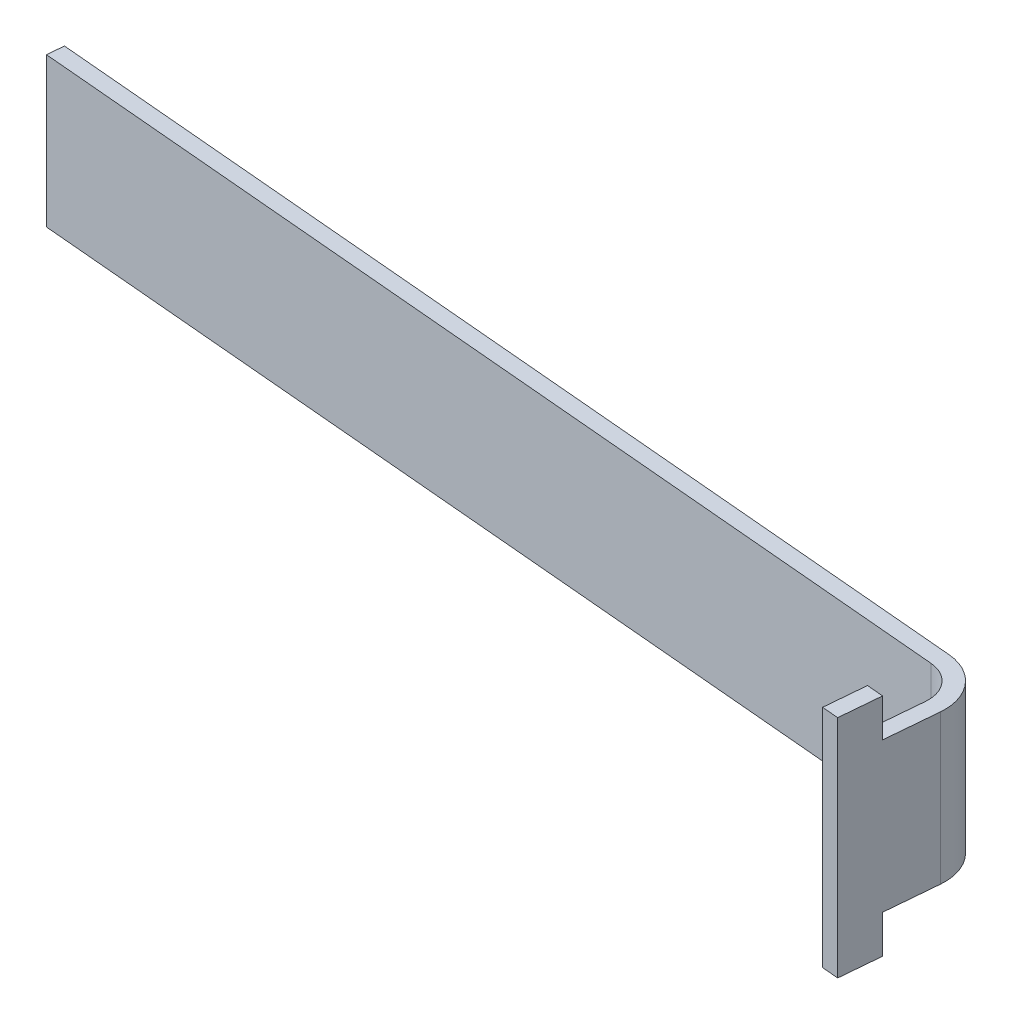
ISO-10303-21;
HEADER;
FILE_DESCRIPTION(('STEP AP214'),'2;1');
FILE_NAME('part.step','',(''),(''),'','','');
FILE_SCHEMA(('AUTOMOTIVE_DESIGN { 1 0 10303 214 1 1 1 1 }'));
ENDSEC;
DATA;
#1=APPLICATION_CONTEXT('core data for automotive mechanical design processes');
#2=APPLICATION_PROTOCOL_DEFINITION('international standard','automotive_design',2000,#1);
#3=PRODUCT_CONTEXT('',#1,'mechanical');
#4=PRODUCT('Part','Part','',(#3));
#5=PRODUCT_RELATED_PRODUCT_CATEGORY('part','',(#4));
#6=PRODUCT_DEFINITION_FORMATION('','',#4);
#7=PRODUCT_DEFINITION_CONTEXT('part definition',#1,'design');
#8=PRODUCT_DEFINITION('design','',#6,#7);
#9=PRODUCT_DEFINITION_SHAPE('','',#8);
#10=(LENGTH_UNIT() NAMED_UNIT(*) SI_UNIT(.MILLI.,.METRE.));
#11=(NAMED_UNIT(*) PLANE_ANGLE_UNIT() SI_UNIT($,.RADIAN.));
#12=(NAMED_UNIT(*) SI_UNIT($,.STERADIAN.) SOLID_ANGLE_UNIT());
#13=UNCERTAINTY_MEASURE_WITH_UNIT(LENGTH_MEASURE(1.E-05),#10,'distance_accuracy_value','');
#14=(GEOMETRIC_REPRESENTATION_CONTEXT(3) GLOBAL_UNCERTAINTY_ASSIGNED_CONTEXT((#13)) GLOBAL_UNIT_ASSIGNED_CONTEXT((#10,
#11,#12)) REPRESENTATION_CONTEXT('',''));
#15=CARTESIAN_POINT('',(0.,0.,0.));
#16=DIRECTION('',(0.,0.,1.));
#17=DIRECTION('',(1.,0.,0.));
#18=AXIS2_PLACEMENT_3D('',#15,#16,#17);
#19=CARTESIAN_POINT('',(-27.6798388038789,2.7391987028386,-10.7652171688286));
#20=DIRECTION('',(-0.996194698091743,0.,-0.0871557427476827));
#21=DIRECTION('',(-0.0871557427476827,0.,0.996194698091743));
#22=AXIS2_PLACEMENT_3D('',#19,#20,#21);
#23=PLANE('',#22);
#24=DIRECTION('',(0.0871557427476827,0.,-0.996194698091743));
#25=VECTOR('',#24,1.);
#26=CARTESIAN_POINT('',(-27.7024992969933,7.2508012971614,-10.5062065473247));
#27=LINE('',#26,#25);
#28=CARTESIAN_POINT('',(-27.7242882326802,7.2508012971614,-10.2571578728018));
#29=VERTEX_POINT('',#28);
#30=CARTESIAN_POINT('',(-27.6807103613064,7.2508012971614,-10.7552552218477));
#31=VERTEX_POINT('',#30);
#32=EDGE_CURVE('E179',#29,#31,#27,.T.);
#33=ORIENTED_EDGE('',*,*,#32,.T.);
#34=DIRECTION('',(0.,1.,0.));
#35=VECTOR('',#34,1.);
#36=CARTESIAN_POINT('',(-27.6807103613064,5.,-10.7552552218477));
#37=LINE('',#36,#35);
#38=CARTESIAN_POINT('',(-27.6807103613064,2.7491987028386,-10.7552552218477));
#39=VERTEX_POINT('',#38);
#40=EDGE_CURVE('E182',#39,#31,#37,.T.);
#41=ORIENTED_EDGE('',*,*,#40,.F.);
#42=DIRECTION('',(0.0871557427476363,0.,-0.996194698091747));
#43=VECTOR('',#42,1.);
#44=CARTESIAN_POINT('',(-27.8162375503035,2.7491987028386,-9.20617236316462));
#45=LINE('',#44,#43);
#46=CARTESIAN_POINT('',(-27.7242882326803,2.7491987028386,-10.2571578728018));
#47=VERTEX_POINT('',#46);
#48=EDGE_CURVE('E191',#47,#39,#45,.T.);
#49=ORIENTED_EDGE('',*,*,#48,.F.);
#50=DIRECTION('',(0.,-1.,0.));
#51=VECTOR('',#50,1.);
#52=CARTESIAN_POINT('',(-27.7242882326803,5.,-10.2571578728018));
#53=LINE('',#52,#51);
#54=EDGE_CURVE('E177',#29,#47,#53,.T.);
#55=ORIENTED_EDGE('',*,*,#54,.F.);
#56=EDGE_LOOP('',(#33,#41,#49,#55));
#57=FACE_BOUND('',#56,.T.);
#58=ADVANCED_FACE('F17',(#57),#23,.T.);
#59=CARTESIAN_POINT('',(-27.7342501796612,2.7391987028386,-10.2580294302293));
#60=DIRECTION('',(-0.0871557427476576,0.,0.996194698091746));
#61=DIRECTION('',(0.996194698091746,0.,0.0871557427476576));
#62=AXIS2_PLACEMENT_3D('',#59,#60,#61);
#63=PLANE('',#62);
#64=DIRECTION('',(0.996194698091746,0.,0.0871557427476576));
#65=VECTOR('',#64,1.);
#66=CARTESIAN_POINT('',(-12.3579842847549,7.2508012971614,-8.91278047706468));
#67=LINE('',#66,#65);
#68=CARTESIAN_POINT('',(1.51402761603295,7.2508012971614,-7.69913669544906));
#69=VERTEX_POINT('',#68);
#70=EDGE_CURVE('E203',#29,#69,#67,.T.);
#71=ORIENTED_EDGE('',*,*,#70,.F.);
#72=ORIENTED_EDGE('',*,*,#54,.T.);
#73=DIRECTION('',(-0.996194698091746,0.,-0.0871557427476576));
#74=VECTOR('',#73,1.);
#75=CARTESIAN_POINT('',(-12.3579842847549,2.7491987028386,-8.91278047706471));
#76=LINE('',#75,#74);
#77=CARTESIAN_POINT('',(1.51402761603295,2.7491987028386,-7.69913669544908));
#78=VERTEX_POINT('',#77);
#79=EDGE_CURVE('E116',#78,#47,#76,.T.);
#80=ORIENTED_EDGE('',*,*,#79,.F.);
#81=DIRECTION('',(0.,-1.,0.));
#82=VECTOR('',#81,1.);
#83=CARTESIAN_POINT('',(1.51402761603295,5.,-7.69913669544908));
#84=LINE('',#83,#82);
#85=EDGE_CURVE('E112',#69,#78,#84,.T.);
#86=ORIENTED_EDGE('',*,*,#85,.F.);
#87=EDGE_LOOP('',(#71,#72,#80,#86));
#88=FACE_BOUND('',#87,.T.);
#89=ADVANCED_FACE('F232',(#88),#63,.T.);
#90=CARTESIAN_POINT('',(1.42687187328529,2.7491987028386,-6.70294199735734));
#91=DIRECTION('',(0.,1.,0.));
#92=DIRECTION('',(0.,0.,1.));
#93=AXIS2_PLACEMENT_3D('',#90,#91,#92);
#94=CYLINDRICAL_SURFACE('',#93,1.);
#95=CARTESIAN_POINT('',(1.42687187328529,7.2508012971614,-6.70294199735734));
#96=DIRECTION('',(0.,1.,0.));
#97=DIRECTION('',(0.,0.,1.));
#98=AXIS2_PLACEMENT_3D('',#95,#96,#97);
#99=CIRCLE('',#98,1.);
#100=CARTESIAN_POINT('',(2.42306657137704,7.2508012971614,-6.61578625460968));
#101=VERTEX_POINT('',#100);
#102=EDGE_CURVE('E155',#69,#101,#99,.F.);
#103=ORIENTED_EDGE('',*,*,#102,.F.);
#104=ORIENTED_EDGE('',*,*,#85,.T.);
#105=CARTESIAN_POINT('',(1.42687187328529,2.7491987028386,-6.70294199735734));
#106=DIRECTION('',(0.,1.,0.));
#107=DIRECTION('',(0.,0.,1.));
#108=AXIS2_PLACEMENT_3D('',#105,#106,#107);
#109=CIRCLE('',#108,1.);
#110=CARTESIAN_POINT('',(2.42306657137704,2.7491987028386,-6.61578625460968));
#111=VERTEX_POINT('',#110);
#112=EDGE_CURVE('E21',#111,#78,#109,.T.);
#113=ORIENTED_EDGE('',*,*,#112,.F.);
#114=DIRECTION('',(0.,-1.,0.));
#115=VECTOR('',#114,1.);
#116=CARTESIAN_POINT('',(2.42306657137704,5.,-6.61578625460968));
#117=LINE('',#116,#115);
#118=EDGE_CURVE('E110',#101,#111,#117,.T.);
#119=ORIENTED_EDGE('',*,*,#118,.F.);
#120=EDGE_LOOP('',(#103,#104,#113,#119));
#121=FACE_BOUND('',#120,.T.);
#122=ADVANCED_FACE('F108',(#121),#94,.F.);
#123=CARTESIAN_POINT('',(3.06273103895279,2.7491987028386,-8.07559081992692));
#124=DIRECTION('',(0.,-1.,0.));
#125=DIRECTION('',(-0.087155742747656,0.,0.996194698091746));
#126=AXIS2_PLACEMENT_3D('',#123,#124,#125);
#127=PLANE('',#126);
#128=DIRECTION('',(-0.087155742747656,0.,0.996194698091746));
#129=VECTOR('',#128,1.);
#130=CARTESIAN_POINT('',(2.9163703455473,2.7491987028386,-6.51741757169038));
#131=LINE('',#130,#129);
#132=CARTESIAN_POINT('',(2.92116392042291,2.7491987028386,-6.57220838323585));
#133=VERTEX_POINT('',#132);
#134=CARTESIAN_POINT('',(2.7808431565502,2.7491987028386,-4.96833471300729));
#135=VERTEX_POINT('',#134);
#136=EDGE_CURVE('E142',#133,#135,#131,.T.);
#137=ORIENTED_EDGE('',*,*,#136,.T.);
#138=DIRECTION('',(-0.996194698091746,0.,-0.0871557427476582));
#139=VECTOR('',#138,1.);
#140=CARTESIAN_POINT('',(-12.5854607913752,2.7491987028386,-6.31271210874441));
#141=LINE('',#140,#139);
#142=CARTESIAN_POINT('',(2.28274580750432,2.7491987028386,-5.01191258438111));
#143=VERTEX_POINT('',#142);
#144=EDGE_CURVE('E122',#135,#143,#141,.T.);
#145=ORIENTED_EDGE('',*,*,#144,.T.);
#146=DIRECTION('',(-0.0871557427476605,0.,0.996194698091745));
#147=VECTOR('',#146,1.);
#148=CARTESIAN_POINT('',(2.29843385022339,2.7491987028386,-5.19122773318805));
#149=LINE('',#148,#147);
#150=EDGE_CURVE('E119',#111,#143,#149,.T.);
#151=ORIENTED_EDGE('',*,*,#150,.F.);
#152=ORIENTED_EDGE('',*,*,#112,.T.);
#153=ORIENTED_EDGE('',*,*,#79,.T.);
#154=ORIENTED_EDGE('',*,*,#48,.T.);
#155=DIRECTION('',(-0.996194698091745,0.,-0.0871557427476585));
#156=VECTOR('',#155,1.);
#157=CARTESIAN_POINT('',(-13.0615524369498,2.7491987028386,-9.47624463317134));
#158=LINE('',#157,#156);
#159=CARTESIAN_POINT('',(1.55760548740678,2.7491987028386,-8.19723404449495));
#160=VERTEX_POINT('',#159);
#161=EDGE_CURVE('E141',#160,#39,#158,.T.);
#162=ORIENTED_EDGE('',*,*,#161,.F.);
#163=CARTESIAN_POINT('',(1.4268718732853,2.7491987028386,-6.70294199735734));
#164=DIRECTION('',(0.,-1.,0.));
#165=DIRECTION('',(0.,0.,-1.));
#166=AXIS2_PLACEMENT_3D('',#163,#164,#165);
#167=CIRCLE('',#166,1.49999999999999);
#168=EDGE_CURVE('E125',#133,#160,#167,.F.);
#169=ORIENTED_EDGE('',*,*,#168,.F.);
#170=EDGE_LOOP('',(#137,#145,#151,#152,#153,#154,#162,#169));
#171=FACE_BOUND('',#170,.T.);
#172=ADVANCED_FACE('F121',(#171),#127,.T.);
#173=CARTESIAN_POINT('',(1.5675674343877,2.7391987028386,-8.19636248706748));
#174=DIRECTION('',(0.0871557427476586,0.,-0.996194698091746));
#175=DIRECTION('',(-0.996194698091746,0.,-0.0871557427476586));
#176=AXIS2_PLACEMENT_3D('',#173,#174,#175);
#177=PLANE('',#176);
#178=DIRECTION('',(-0.996194698091746,0.,-0.0871557427476575));
#179=VECTOR('',#178,1.);
#180=CARTESIAN_POINT('',(-12.314406413381,7.2508012971614,-9.41087782611058));
#181=LINE('',#180,#179);
#182=CARTESIAN_POINT('',(1.55760548740678,7.2508012971614,-8.19723404449495));
#183=VERTEX_POINT('',#182);
#184=EDGE_CURVE('E185',#183,#31,#181,.T.);
#185=ORIENTED_EDGE('',*,*,#184,.F.);
#186=DIRECTION('',(0.,1.,0.));
#187=VECTOR('',#186,1.);
#188=CARTESIAN_POINT('',(1.55760548740678,5.,-8.19723404449495));
#189=LINE('',#188,#187);
#190=EDGE_CURVE('E201',#160,#183,#189,.T.);
#191=ORIENTED_EDGE('',*,*,#190,.F.);
#192=ORIENTED_EDGE('',*,*,#161,.T.);
#193=ORIENTED_EDGE('',*,*,#40,.T.);
#194=EDGE_LOOP('',(#185,#191,#192,#193));
#195=FACE_BOUND('',#194,.T.);
#196=ADVANCED_FACE('F237',(#195),#177,.T.);
#197=CARTESIAN_POINT('',(2.78993354610364,7.2508012971614,-4.95750120859889));
#198=DIRECTION('',(0.,1.,0.));
#199=DIRECTION('',(0.087155742747656,0.,-0.996194698091746));
#200=AXIS2_PLACEMENT_3D('',#197,#198,#199);
#201=PLANE('',#200);
#202=DIRECTION('',(0.996194698091746,0.,0.0871557427476582));
#203=VECTOR('',#202,1.);
#204=CARTESIAN_POINT('',(-12.5854607913752,7.2508012971614,-6.3127121087444));
#205=LINE('',#204,#203);
#206=CARTESIAN_POINT('',(2.28274580750432,7.2508012971614,-5.01191258438111));
#207=VERTEX_POINT('',#206);
#208=CARTESIAN_POINT('',(2.7808431565502,7.2508012971614,-4.96833471300728));
#209=VERTEX_POINT('',#208);
#210=EDGE_CURVE('E152',#207,#209,#205,.T.);
#211=ORIENTED_EDGE('',*,*,#210,.T.);
#212=DIRECTION('',(0.087155742747656,0.,-0.996194698091746));
#213=VECTOR('',#212,1.);
#214=CARTESIAN_POINT('',(2.9163703455473,7.2508012971614,-6.51741757169038));
#215=LINE('',#214,#213);
#216=CARTESIAN_POINT('',(2.92116392042291,7.2508012971614,-6.57220838323585));
#217=VERTEX_POINT('',#216);
#218=EDGE_CURVE('E147',#209,#217,#215,.T.);
#219=ORIENTED_EDGE('',*,*,#218,.T.);
#220=CARTESIAN_POINT('',(1.4268718732853,7.2508012971614,-6.70294199735734));
#221=DIRECTION('',(0.,-1.,0.));
#222=DIRECTION('',(0.,0.,-1.));
#223=AXIS2_PLACEMENT_3D('',#220,#221,#222);
#224=CIRCLE('',#223,1.49999999999999);
#225=EDGE_CURVE('E161',#183,#217,#224,.T.);
#226=ORIENTED_EDGE('',*,*,#225,.F.);
#227=ORIENTED_EDGE('',*,*,#184,.T.);
#228=ORIENTED_EDGE('',*,*,#32,.F.);
#229=ORIENTED_EDGE('',*,*,#70,.T.);
#230=ORIENTED_EDGE('',*,*,#102,.T.);
#231=DIRECTION('',(0.0871557427476607,0.,-0.996194698091745));
#232=VECTOR('',#231,1.);
#233=CARTESIAN_POINT('',(2.29843385022339,7.2508012971614,-5.19122773318805));
#234=LINE('',#233,#232);
#235=EDGE_CURVE('E130',#207,#101,#234,.T.);
#236=ORIENTED_EDGE('',*,*,#235,.F.);
#237=EDGE_LOOP('',(#211,#219,#226,#227,#228,#229,#230,#236));
#238=FACE_BOUND('',#237,.T.);
#239=ADVANCED_FACE('F266',(#238),#201,.T.);
#240=CARTESIAN_POINT('',(2.42393812880452,1.59,-6.6257482015906));
#241=DIRECTION('',(-0.996194698091745,0.,-0.0871557427476607));
#242=DIRECTION('',(-0.0871557427476607,0.,0.996194698091745));
#243=AXIS2_PLACEMENT_3D('',#240,#241,#242);
#244=PLANE('',#243);
#245=ORIENTED_EDGE('',*,*,#118,.T.);
#246=ORIENTED_EDGE('',*,*,#150,.T.);
#247=DIRECTION('',(0.,-1.,0.));
#248=VECTOR('',#247,1.);
#249=CARTESIAN_POINT('',(2.28274580750432,5.,-5.01191258438111));
#250=LINE('',#249,#248);
#251=CARTESIAN_POINT('',(2.28274580750432,1.6,-5.01191258438111));
#252=VERTEX_POINT('',#251);
#253=EDGE_CURVE('E145',#143,#252,#250,.T.);
#254=ORIENTED_EDGE('',*,*,#253,.T.);
#255=DIRECTION('',(-0.0871557427476607,0.,0.996194698091745));
#256=VECTOR('',#255,1.);
#257=CARTESIAN_POINT('',(2.29843385022339,1.6,-5.19122773318805));
#258=LINE('',#257,#256);
#259=CARTESIAN_POINT('',(2.17380112906975,1.6,-3.76666921176643));
#260=VERTEX_POINT('',#259);
#261=EDGE_CURVE('E132',#252,#260,#258,.T.);
#262=ORIENTED_EDGE('',*,*,#261,.T.);
#263=DIRECTION('',(0.,-1.,0.));
#264=VECTOR('',#263,1.);
#265=CARTESIAN_POINT('',(2.17380112906975,5.,-3.76666921176643));
#266=LINE('',#265,#264);
#267=CARTESIAN_POINT('',(2.17380112906975,8.4,-3.76666921176643));
#268=VERTEX_POINT('',#267);
#269=EDGE_CURVE('E250',#268,#260,#266,.T.);
#270=ORIENTED_EDGE('',*,*,#269,.F.);
#271=DIRECTION('',(-0.0871557427476531,0.,0.996194698091746));
#272=VECTOR('',#271,1.);
#273=CARTESIAN_POINT('',(2.22827346828704,8.4,-4.38929089807377));
#274=LINE('',#273,#272);
#275=CARTESIAN_POINT('',(2.28274580750432,8.4,-5.01191258438111));
#276=VERTEX_POINT('',#275);
#277=EDGE_CURVE('E260',#276,#268,#274,.T.);
#278=ORIENTED_EDGE('',*,*,#277,.F.);
#279=DIRECTION('',(0.,1.,0.));
#280=VECTOR('',#279,1.);
#281=CARTESIAN_POINT('',(2.28274580750432,7.8254006485807,-5.01191258438111));
#282=LINE('',#281,#280);
#283=EDGE_CURVE('E158',#207,#276,#282,.T.);
#284=ORIENTED_EDGE('',*,*,#283,.F.);
#285=ORIENTED_EDGE('',*,*,#235,.T.);
#286=EDGE_LOOP('',(#245,#246,#254,#262,#270,#278,#284,#285));
#287=FACE_BOUND('',#286,.T.);
#288=ADVANCED_FACE('F127',(#287),#244,.T.);
#289=CARTESIAN_POINT('',(1.4268718732853,7.2508012971614,-6.70294199735734));
#290=DIRECTION('',(0.,-1.,0.));
#291=DIRECTION('',(0.,0.,-1.));
#292=AXIS2_PLACEMENT_3D('',#289,#290,#291);
#293=CYLINDRICAL_SURFACE('',#292,1.49999999999999);
#294=ORIENTED_EDGE('',*,*,#225,.T.);
#295=DIRECTION('',(0.,1.,0.));
#296=VECTOR('',#295,1.);
#297=CARTESIAN_POINT('',(2.92116392042291,5.,-6.57220838323585));
#298=LINE('',#297,#296);
#299=EDGE_CURVE('E173',#133,#217,#298,.T.);
#300=ORIENTED_EDGE('',*,*,#299,.F.);
#301=ORIENTED_EDGE('',*,*,#168,.T.);
#302=ORIENTED_EDGE('',*,*,#190,.T.);
#303=EDGE_LOOP('',(#294,#300,#301,#302));
#304=FACE_BOUND('',#303,.T.);
#305=ADVANCED_FACE('F241',(#304),#293,.T.);
#306=CARTESIAN_POINT('',(2.79080510353111,8.41,-4.96746315557981));
#307=DIRECTION('',(0.0871557427476482,0.,-0.996194698091746));
#308=DIRECTION('',(0.,-1.,0.));
#309=AXIS2_PLACEMENT_3D('',#306,#307,#308);
#310=PLANE('',#309);
#311=ORIENTED_EDGE('',*,*,#210,.F.);
#312=ORIENTED_EDGE('',*,*,#283,.T.);
#313=DIRECTION('',(-0.996194698091746,0.,-0.0871557427476498));
#314=VECTOR('',#313,1.);
#315=CARTESIAN_POINT('',(2.53179448202726,8.4,-4.9901236486942));
#316=LINE('',#315,#314);
#317=CARTESIAN_POINT('',(2.7808431565502,8.4,-4.96833471300729));
#318=VERTEX_POINT('',#317);
#319=EDGE_CURVE('E160',#318,#276,#316,.T.);
#320=ORIENTED_EDGE('',*,*,#319,.F.);
#321=DIRECTION('',(0.,1.,0.));
#322=VECTOR('',#321,1.);
#323=CARTESIAN_POINT('',(2.7808431565502,5.,-4.96833471300729));
#324=LINE('',#323,#322);
#325=EDGE_CURVE('E169',#209,#318,#324,.T.);
#326=ORIENTED_EDGE('',*,*,#325,.F.);
#327=EDGE_LOOP('',(#311,#312,#320,#326));
#328=FACE_BOUND('',#327,.T.);
#329=ADVANCED_FACE('F268',(#328),#310,.T.);
#330=CARTESIAN_POINT('',(2.16296762466136,8.4,-3.75757882221299));
#331=DIRECTION('',(0.,1.,0.));
#332=DIRECTION('',(0.996194698091746,0.,0.0871557427476555));
#333=AXIS2_PLACEMENT_3D('',#330,#331,#332);
#334=PLANE('',#333);
#335=DIRECTION('',(-0.996194698091746,0.,-0.087155742747654));
#336=VECTOR('',#335,1.);
#337=CARTESIAN_POINT('',(2.42284980359269,8.4,-3.74488027607952));
#338=LINE('',#337,#336);
#339=CARTESIAN_POINT('',(2.67189847811562,8.4,-3.7230913403926));
#340=VERTEX_POINT('',#339);
#341=EDGE_CURVE('E258',#340,#268,#338,.T.);
#342=ORIENTED_EDGE('',*,*,#341,.F.);
#343=DIRECTION('',(-0.0871557427476579,0.,0.996194698091745));
#344=VECTOR('',#343,1.);
#345=CARTESIAN_POINT('',(2.79653119926927,8.4,-5.14764986181423));
#346=LINE('',#345,#344);
#347=EDGE_CURVE('E172',#318,#340,#346,.T.);
#348=ORIENTED_EDGE('',*,*,#347,.F.);
#349=ORIENTED_EDGE('',*,*,#319,.T.);
#350=ORIENTED_EDGE('',*,*,#277,.T.);
#351=EDGE_LOOP('',(#342,#348,#349,#350));
#352=FACE_BOUND('',#351,.T.);
#353=ADVANCED_FACE('F275',(#352),#334,.T.);
#354=CARTESIAN_POINT('',(2.16383918208883,1.59,-3.76754076919391));
#355=DIRECTION('',(-0.0871557427476539,0.,0.996194698091746));
#356=DIRECTION('',(0.996194698091746,0.,0.0871557427476539));
#357=AXIS2_PLACEMENT_3D('',#354,#355,#356);
#358=PLANE('',#357);
#359=ORIENTED_EDGE('',*,*,#269,.T.);
#360=DIRECTION('',(0.996194698091746,0.,0.0871557427476539));
#361=VECTOR('',#360,1.);
#362=CARTESIAN_POINT('',(2.42284980359269,1.6,-3.74488027607952));
#363=LINE('',#362,#361);
#364=CARTESIAN_POINT('',(2.67189847811562,1.6,-3.7230913403926));
#365=VERTEX_POINT('',#364);
#366=EDGE_CURVE('E222',#260,#365,#363,.T.);
#367=ORIENTED_EDGE('',*,*,#366,.T.);
#368=DIRECTION('',(0.,-1.,0.));
#369=VECTOR('',#368,1.);
#370=CARTESIAN_POINT('',(2.67189847811563,5.,-3.7230913403926));
#371=LINE('',#370,#369);
#372=EDGE_CURVE('E271',#340,#365,#371,.T.);
#373=ORIENTED_EDGE('',*,*,#372,.F.);
#374=ORIENTED_EDGE('',*,*,#341,.T.);
#375=EDGE_LOOP('',(#359,#367,#373,#374));
#376=FACE_BOUND('',#375,.T.);
#377=ADVANCED_FACE('F257',(#376),#358,.T.);
#378=CARTESIAN_POINT('',(2.67102692068815,1.59,-3.71312939341169));
#379=DIRECTION('',(0.996194698091746,0.,0.0871557427476579));
#380=DIRECTION('',(0.0871557427476579,0.,-0.996194698091746));
#381=AXIS2_PLACEMENT_3D('',#378,#379,#380);
#382=PLANE('',#381);
#383=ORIENTED_EDGE('',*,*,#372,.T.);
#384=DIRECTION('',(-0.0871557427476526,0.,0.996194698091746));
#385=VECTOR('',#384,1.);
#386=CARTESIAN_POINT('',(2.72637081733292,1.6,-4.34571302669995));
#387=LINE('',#386,#385);
#388=CARTESIAN_POINT('',(2.7808431565502,1.6,-4.96833471300729));
#389=VERTEX_POINT('',#388);
#390=EDGE_CURVE('E36',#389,#365,#387,.T.);
#391=ORIENTED_EDGE('',*,*,#390,.F.);
#392=DIRECTION('',(0.,-1.,0.));
#393=VECTOR('',#392,1.);
#394=CARTESIAN_POINT('',(2.7808431565502,2.1745993514193,-4.96833471300729));
#395=LINE('',#394,#393);
#396=EDGE_CURVE('E27',#135,#389,#395,.T.);
#397=ORIENTED_EDGE('',*,*,#396,.F.);
#398=ORIENTED_EDGE('',*,*,#136,.F.);
#399=ORIENTED_EDGE('',*,*,#299,.T.);
#400=ORIENTED_EDGE('',*,*,#218,.F.);
#401=ORIENTED_EDGE('',*,*,#325,.T.);
#402=ORIENTED_EDGE('',*,*,#347,.T.);
#403=EDGE_LOOP('',(#383,#391,#397,#398,#399,#400,#401,#402));
#404=FACE_BOUND('',#403,.T.);
#405=ADVANCED_FACE('F243',(#404),#382,.T.);
#406=CARTESIAN_POINT('',(2.68098886766907,1.6,-3.71225783598421));
#407=DIRECTION('',(0.,-1.,0.));
#408=DIRECTION('',(-0.996194698091746,0.,-0.0871557427476555));
#409=AXIS2_PLACEMENT_3D('',#406,#407,#408);
#410=PLANE('',#409);
#411=ORIENTED_EDGE('',*,*,#366,.F.);
#412=ORIENTED_EDGE('',*,*,#261,.F.);
#413=DIRECTION('',(-0.996194698091746,0.,-0.0871557427476482));
#414=VECTOR('',#413,1.);
#415=CARTESIAN_POINT('',(2.53179448202726,1.6,-4.9901236486942));
#416=LINE('',#415,#414);
#417=EDGE_CURVE('E11',#389,#252,#416,.T.);
#418=ORIENTED_EDGE('',*,*,#417,.F.);
#419=ORIENTED_EDGE('',*,*,#390,.T.);
#420=EDGE_LOOP('',(#411,#412,#418,#419));
#421=FACE_BOUND('',#420,.T.);
#422=ADVANCED_FACE('F253',(#421),#410,.T.);
#423=CARTESIAN_POINT('',(2.79080510353111,2.7591987028386,-4.96746315557981));
#424=DIRECTION('',(0.0871557427476482,0.,-0.996194698091746));
#425=DIRECTION('',(0.,-1.,0.));
#426=AXIS2_PLACEMENT_3D('',#423,#424,#425);
#427=PLANE('',#426);
#428=ORIENTED_EDGE('',*,*,#396,.T.);
#429=ORIENTED_EDGE('',*,*,#417,.T.);
#430=ORIENTED_EDGE('',*,*,#253,.F.);
#431=ORIENTED_EDGE('',*,*,#144,.F.);
#432=EDGE_LOOP('',(#428,#429,#430,#431));
#433=FACE_BOUND('',#432,.T.);
#434=ADVANCED_FACE('F19',(#433),#427,.T.);
#435=CLOSED_SHELL('',(#58,#89,#122,#172,#196,#239,#288,#305,#329,#353,#377,#405,#422,#434));
#436=MANIFOLD_SOLID_BREP('B1',#435);
#437=ADVANCED_BREP_SHAPE_REPRESENTATION('',(#18,#436),#14);
#438=SHAPE_DEFINITION_REPRESENTATION(#9,#437);
ENDSEC;
END-ISO-10303-21;
